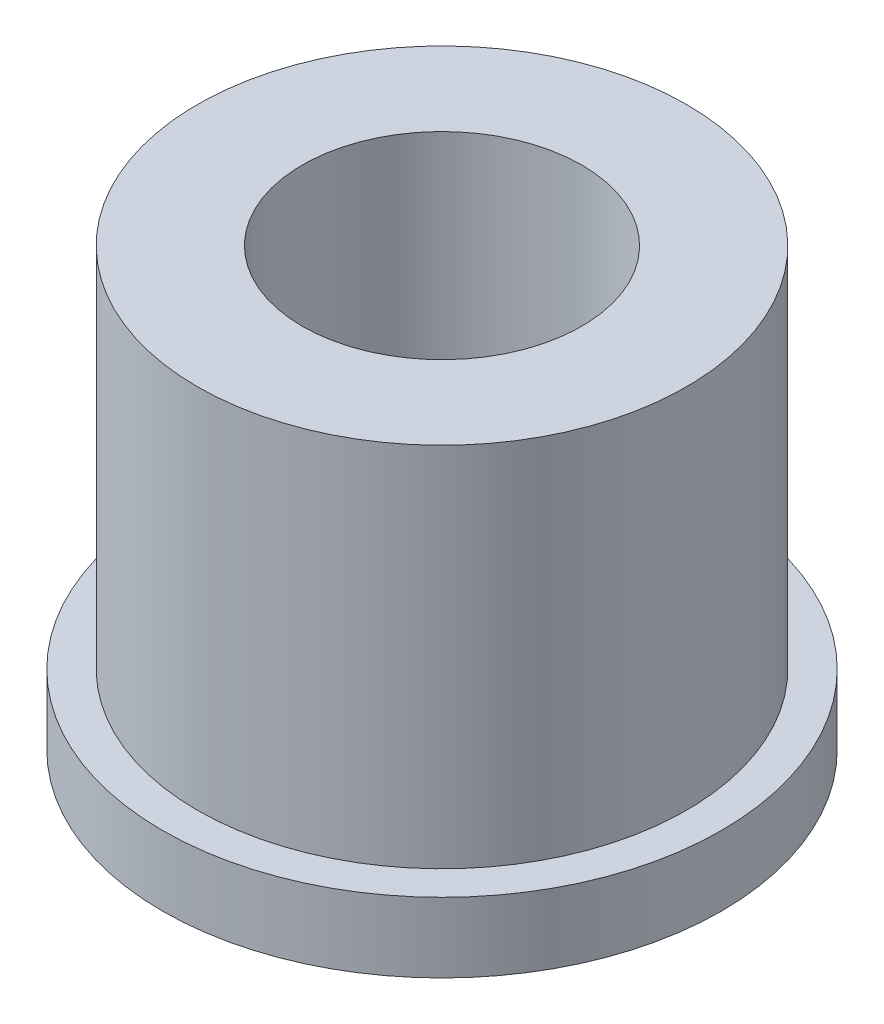
ISO-10303-21;
HEADER;
FILE_DESCRIPTION(('STEP AP214'),'2;1');
FILE_NAME('part.step','',(''),(''),'','','');
FILE_SCHEMA(('AUTOMOTIVE_DESIGN { 1 0 10303 214 1 1 1 1 }'));
ENDSEC;
DATA;
#1=APPLICATION_CONTEXT('core data for automotive mechanical design processes');
#2=APPLICATION_PROTOCOL_DEFINITION('international standard','automotive_design',2000,#1);
#3=PRODUCT_CONTEXT('',#1,'mechanical');
#4=PRODUCT('Part','Part','',(#3));
#5=PRODUCT_RELATED_PRODUCT_CATEGORY('part','',(#4));
#6=PRODUCT_DEFINITION_FORMATION('','',#4);
#7=PRODUCT_DEFINITION_CONTEXT('part definition',#1,'design');
#8=PRODUCT_DEFINITION('design','',#6,#7);
#9=PRODUCT_DEFINITION_SHAPE('','',#8);
#10=(LENGTH_UNIT() NAMED_UNIT(*) SI_UNIT(.MILLI.,.METRE.));
#11=(NAMED_UNIT(*) PLANE_ANGLE_UNIT() SI_UNIT($,.RADIAN.));
#12=(NAMED_UNIT(*) SI_UNIT($,.STERADIAN.) SOLID_ANGLE_UNIT());
#13=UNCERTAINTY_MEASURE_WITH_UNIT(LENGTH_MEASURE(1.E-05),#10,'distance_accuracy_value','');
#14=(GEOMETRIC_REPRESENTATION_CONTEXT(3) GLOBAL_UNCERTAINTY_ASSIGNED_CONTEXT((#13)) GLOBAL_UNIT_ASSIGNED_CONTEXT((#10,
#11,#12)) REPRESENTATION_CONTEXT('',''));
#15=CARTESIAN_POINT('',(0.,0.,0.));
#16=DIRECTION('',(0.,0.,1.));
#17=DIRECTION('',(1.,0.,0.));
#18=AXIS2_PLACEMENT_3D('',#15,#16,#17);
#19=CARTESIAN_POINT('',(0.,6.25,0.));
#20=DIRECTION('',(0.,-1.,0.));
#21=DIRECTION('',(0.,0.,-1.));
#22=AXIS2_PLACEMENT_3D('',#19,#20,#21);
#23=CYLINDRICAL_SURFACE('',#22,3.5);
#24=CARTESIAN_POINT('',(0.,6.25,0.));
#25=DIRECTION('',(0.,1.,0.));
#26=DIRECTION('',(0.,0.,1.));
#27=AXIS2_PLACEMENT_3D('',#24,#25,#26);
#28=CIRCLE('',#27,3.5);
#29=CARTESIAN_POINT('',(0.,6.25,3.5));
#30=VERTEX_POINT('',#29);
#31=EDGE_CURVE('E33',#30,#30,#28,.T.);
#32=ORIENTED_EDGE('',*,*,#31,.F.);
#33=EDGE_LOOP('',(#32));
#34=FACE_BOUND('',#33,.T.);
#35=CARTESIAN_POINT('',(0.,1.,0.));
#36=DIRECTION('',(0.,-1.,0.));
#37=DIRECTION('',(0.,0.,-1.));
#38=AXIS2_PLACEMENT_3D('',#35,#36,#37);
#39=CIRCLE('',#38,3.5);
#40=CARTESIAN_POINT('',(0.,1.,-3.5));
#41=VERTEX_POINT('',#40);
#42=EDGE_CURVE('E10',#41,#41,#39,.T.);
#43=ORIENTED_EDGE('',*,*,#42,.F.);
#44=EDGE_LOOP('',(#43));
#45=FACE_BOUND('',#44,.T.);
#46=ADVANCED_FACE('F30',(#34,#45),#23,.T.);
#47=CARTESIAN_POINT('',(0.,6.25,0.));
#48=DIRECTION('',(0.,1.,0.));
#49=DIRECTION('',(0.,0.,1.));
#50=AXIS2_PLACEMENT_3D('',#47,#48,#49);
#51=PLANE('',#50);
#52=ORIENTED_EDGE('',*,*,#31,.T.);
#53=EDGE_LOOP('',(#52));
#54=FACE_BOUND('',#53,.T.);
#55=CARTESIAN_POINT('',(0.,6.25,0.));
#56=DIRECTION('',(0.,1.,0.));
#57=DIRECTION('',(0.,0.,1.));
#58=AXIS2_PLACEMENT_3D('',#55,#56,#57);
#59=CIRCLE('',#58,2.);
#60=CARTESIAN_POINT('',(0.,6.25,2.));
#61=VERTEX_POINT('',#60);
#62=EDGE_CURVE('E41',#61,#61,#59,.T.);
#63=ORIENTED_EDGE('',*,*,#62,.F.);
#64=EDGE_LOOP('',(#63));
#65=FACE_BOUND('',#64,.T.);
#66=ADVANCED_FACE('F72',(#54,#65),#51,.T.);
#67=CARTESIAN_POINT('',(0.,0.,0.));
#68=DIRECTION('',(0.,1.,0.));
#69=DIRECTION('',(0.,0.,1.));
#70=AXIS2_PLACEMENT_3D('',#67,#68,#69);
#71=PLANE('',#70);
#72=CARTESIAN_POINT('',(0.,0.,0.));
#73=DIRECTION('',(0.,1.,0.));
#74=DIRECTION('',(0.,0.,1.));
#75=AXIS2_PLACEMENT_3D('',#72,#73,#74);
#76=CIRCLE('',#75,2.);
#77=CARTESIAN_POINT('',(0.,0.,2.));
#78=VERTEX_POINT('',#77);
#79=EDGE_CURVE('E47',#78,#78,#76,.T.);
#80=ORIENTED_EDGE('',*,*,#79,.T.);
#81=EDGE_LOOP('',(#80));
#82=FACE_BOUND('',#81,.T.);
#83=CARTESIAN_POINT('',(0.,0.,0.));
#84=DIRECTION('',(0.,-1.,0.));
#85=DIRECTION('',(0.,0.,-1.));
#86=AXIS2_PLACEMENT_3D('',#83,#84,#85);
#87=CIRCLE('',#86,4.);
#88=CARTESIAN_POINT('',(0.,0.,-4.));
#89=VERTEX_POINT('',#88);
#90=EDGE_CURVE('E44',#89,#89,#87,.T.);
#91=ORIENTED_EDGE('',*,*,#90,.T.);
#92=EDGE_LOOP('',(#91));
#93=FACE_BOUND('',#92,.T.);
#94=ADVANCED_FACE('F58',(#82,#93),#71,.F.);
#95=CARTESIAN_POINT('',(0.,6.25,0.));
#96=DIRECTION('',(0.,-1.,0.));
#97=DIRECTION('',(0.,0.,-1.));
#98=AXIS2_PLACEMENT_3D('',#95,#96,#97);
#99=CYLINDRICAL_SURFACE('',#98,2.);
#100=ORIENTED_EDGE('',*,*,#79,.F.);
#101=EDGE_LOOP('',(#100));
#102=FACE_BOUND('',#101,.T.);
#103=ORIENTED_EDGE('',*,*,#62,.T.);
#104=EDGE_LOOP('',(#103));
#105=FACE_BOUND('',#104,.T.);
#106=ADVANCED_FACE('F67',(#102,#105),#99,.F.);
#107=CARTESIAN_POINT('',(0.,1.,0.));
#108=DIRECTION('',(0.,-1.,0.));
#109=DIRECTION('',(0.,0.,-1.));
#110=AXIS2_PLACEMENT_3D('',#107,#108,#109);
#111=PLANE('',#110);
#112=CARTESIAN_POINT('',(0.,1.,0.));
#113=DIRECTION('',(0.,-1.,0.));
#114=DIRECTION('',(0.,0.,-1.));
#115=AXIS2_PLACEMENT_3D('',#112,#113,#114);
#116=CIRCLE('',#115,4.);
#117=CARTESIAN_POINT('',(0.,1.,-4.));
#118=VERTEX_POINT('',#117);
#119=EDGE_CURVE('E49',#118,#118,#116,.T.);
#120=ORIENTED_EDGE('',*,*,#119,.F.);
#121=EDGE_LOOP('',(#120));
#122=FACE_BOUND('',#121,.T.);
#123=ORIENTED_EDGE('',*,*,#42,.T.);
#124=EDGE_LOOP('',(#123));
#125=FACE_BOUND('',#124,.T.);
#126=ADVANCED_FACE('F62',(#122,#125),#111,.F.);
#127=CARTESIAN_POINT('',(0.,1.,0.));
#128=DIRECTION('',(0.,-1.,0.));
#129=DIRECTION('',(0.,0.,-1.));
#130=AXIS2_PLACEMENT_3D('',#127,#128,#129);
#131=CYLINDRICAL_SURFACE('',#130,4.);
#132=ORIENTED_EDGE('',*,*,#119,.T.);
#133=EDGE_LOOP('',(#132));
#134=FACE_BOUND('',#133,.T.);
#135=ORIENTED_EDGE('',*,*,#90,.F.);
#136=EDGE_LOOP('',(#135));
#137=FACE_BOUND('',#136,.T.);
#138=ADVANCED_FACE('F60',(#134,#137),#131,.T.);
#139=CLOSED_SHELL('',(#46,#66,#94,#106,#126,#138));
#140=MANIFOLD_SOLID_BREP('B2',#139);
#141=ADVANCED_BREP_SHAPE_REPRESENTATION('',(#18,#140),#14);
#142=SHAPE_DEFINITION_REPRESENTATION(#9,#141);
ENDSEC;
END-ISO-10303-21;
